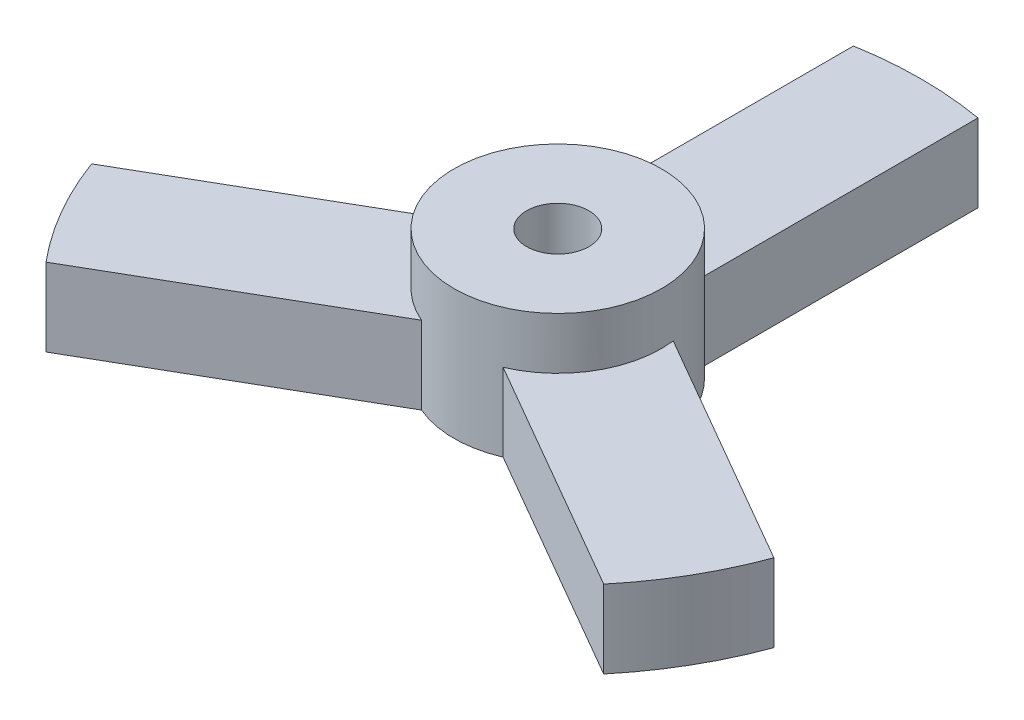
ISO-10303-21;
HEADER;
FILE_DESCRIPTION(('STEP AP214'),'2;1');
FILE_NAME('part.step','',(''),(''),'','','');
FILE_SCHEMA(('AUTOMOTIVE_DESIGN { 1 0 10303 214 1 1 1 1 }'));
ENDSEC;
DATA;
#1=APPLICATION_CONTEXT('core data for automotive mechanical design processes');
#2=APPLICATION_PROTOCOL_DEFINITION('international standard','automotive_design',2000,#1);
#3=PRODUCT_CONTEXT('',#1,'mechanical');
#4=PRODUCT('Part','Part','',(#3));
#5=PRODUCT_RELATED_PRODUCT_CATEGORY('part','',(#4));
#6=PRODUCT_DEFINITION_FORMATION('','',#4);
#7=PRODUCT_DEFINITION_CONTEXT('part definition',#1,'design');
#8=PRODUCT_DEFINITION('design','',#6,#7);
#9=PRODUCT_DEFINITION_SHAPE('','',#8);
#10=(LENGTH_UNIT() NAMED_UNIT(*) SI_UNIT(.MILLI.,.METRE.));
#11=(NAMED_UNIT(*) PLANE_ANGLE_UNIT() SI_UNIT($,.RADIAN.));
#12=(NAMED_UNIT(*) SI_UNIT($,.STERADIAN.) SOLID_ANGLE_UNIT());
#13=UNCERTAINTY_MEASURE_WITH_UNIT(LENGTH_MEASURE(1.E-05),#10,'distance_accuracy_value','');
#14=(GEOMETRIC_REPRESENTATION_CONTEXT(3) GLOBAL_UNCERTAINTY_ASSIGNED_CONTEXT((#13)) GLOBAL_UNIT_ASSIGNED_CONTEXT((#10,
#11,#12)) REPRESENTATION_CONTEXT('',''));
#15=CARTESIAN_POINT('',(0.,0.,0.));
#16=DIRECTION('',(0.,0.,1.));
#17=DIRECTION('',(1.,0.,0.));
#18=AXIS2_PLACEMENT_3D('',#15,#16,#17);
#19=CARTESIAN_POINT('',(0.,7.5,0.));
#20=DIRECTION('',(0.,-1.,0.));
#21=DIRECTION('',(0.,0.,-1.));
#22=AXIS2_PLACEMENT_3D('',#19,#20,#21);
#23=PLANE('',#22);
#24=CARTESIAN_POINT('',(0.,7.5,0.));
#25=DIRECTION('',(0.,1.,0.));
#26=DIRECTION('',(0.,0.,1.));
#27=AXIS2_PLACEMENT_3D('',#24,#25,#26);
#28=CIRCLE('',#27,10.);
#29=CARTESIAN_POINT('',(3.92820323027547,7.5,9.19615242270665));
#30=VERTEX_POINT('',#29);
#31=CARTESIAN_POINT('',(9.92820323027551,7.5,-1.19615242270659));
#32=VERTEX_POINT('',#31);
#33=EDGE_CURVE('E49',#30,#32,#28,.T.);
#34=ORIENTED_EDGE('',*,*,#33,.F.);
#35=DIRECTION('',(0.866025403784436,0.,0.500000000000004));
#36=VECTOR('',#35,1.);
#37=CARTESIAN_POINT('',(26.8621834432781,7.5,22.4370920722734));
#38=LINE('',#37,#36);
#39=CARTESIAN_POINT('',(26.8621834432781,7.5,22.4370920722734));
#40=VERTEX_POINT('',#39);
#41=EDGE_CURVE('E220',#30,#40,#38,.T.);
#42=ORIENTED_EDGE('',*,*,#41,.T.);
#43=CARTESIAN_POINT('',(0.,7.5,0.));
#44=DIRECTION('',(0.,1.,0.));
#45=DIRECTION('',(0.,0.,-1.));
#46=AXIS2_PLACEMENT_3D('',#43,#44,#45);
#47=CIRCLE('',#46,35.);
#48=CARTESIAN_POINT('',(32.8621834432782,7.5,12.0447872268602));
#49=VERTEX_POINT('',#48);
#50=EDGE_CURVE('E143',#40,#49,#47,.T.);
#51=ORIENTED_EDGE('',*,*,#50,.T.);
#52=DIRECTION('',(-0.866025403784436,0.,-0.500000000000004));
#53=VECTOR('',#52,1.);
#54=CARTESIAN_POINT('',(32.8621834432782,7.5,12.0447872268602));
#55=LINE('',#54,#53);
#56=EDGE_CURVE('E139',#49,#32,#55,.T.);
#57=ORIENTED_EDGE('',*,*,#56,.T.);
#58=EDGE_LOOP('',(#34,#42,#51,#57));
#59=FACE_BOUND('',#58,.T.);
#60=ADVANCED_FACE('F37',(#59),#23,.F.);
#61=CARTESIAN_POINT('',(6.,7.5,-8.));
#62=VERTEX_POINT('',#61);
#63=CARTESIAN_POINT('',(-6.,7.5,-8.));
#64=VERTEX_POINT('',#63);
#65=EDGE_CURVE('E11',#62,#64,#28,.T.);
#66=ORIENTED_EDGE('',*,*,#65,.F.);
#67=DIRECTION('',(0.,0.,-1.));
#68=VECTOR('',#67,1.);
#69=CARTESIAN_POINT('',(6.,7.5,-34.4818792991333));
#70=LINE('',#69,#68);
#71=CARTESIAN_POINT('',(6.,7.5,-34.4818792991333));
#72=VERTEX_POINT('',#71);
#73=EDGE_CURVE('E57',#62,#72,#70,.T.);
#74=ORIENTED_EDGE('',*,*,#73,.T.);
#75=CARTESIAN_POINT('',(0.,7.5,0.));
#76=DIRECTION('',(0.,1.,0.));
#77=DIRECTION('',(0.,0.,-1.));
#78=AXIS2_PLACEMENT_3D('',#75,#76,#77);
#79=CIRCLE('',#78,35.);
#80=CARTESIAN_POINT('',(-6.,7.5,-34.4818792991333));
#81=VERTEX_POINT('',#80);
#82=EDGE_CURVE('E198',#72,#81,#79,.T.);
#83=ORIENTED_EDGE('',*,*,#82,.T.);
#84=DIRECTION('',(0.,0.,1.));
#85=VECTOR('',#84,1.);
#86=CARTESIAN_POINT('',(-6.,7.5,-34.4818792991333));
#87=LINE('',#86,#85);
#88=EDGE_CURVE('E114',#81,#64,#87,.T.);
#89=ORIENTED_EDGE('',*,*,#88,.T.);
#90=EDGE_LOOP('',(#66,#74,#83,#89));
#91=FACE_BOUND('',#90,.T.);
#92=ADVANCED_FACE('F229',(#91),#23,.F.);
#93=CARTESIAN_POINT('',(-9.9282032302755,7.5,-1.19615242270672));
#94=VERTEX_POINT('',#93);
#95=CARTESIAN_POINT('',(-3.92820323027559,7.5,9.1961524227066));
#96=VERTEX_POINT('',#95);
#97=EDGE_CURVE('E47',#94,#96,#28,.T.);
#98=ORIENTED_EDGE('',*,*,#97,.F.);
#99=DIRECTION('',(-0.866025403784443,0.,0.499999999999992));
#100=VECTOR('',#99,1.);
#101=CARTESIAN_POINT('',(-32.8621834432783,7.5,12.0447872268597));
#102=LINE('',#101,#100);
#103=CARTESIAN_POINT('',(-32.8621834432783,7.5,12.0447872268597));
#104=VERTEX_POINT('',#103);
#105=EDGE_CURVE('E226',#94,#104,#102,.T.);
#106=ORIENTED_EDGE('',*,*,#105,.T.);
#107=CARTESIAN_POINT('',(0.,7.5,0.));
#108=DIRECTION('',(0.,1.,0.));
#109=DIRECTION('',(0.,0.,-1.));
#110=AXIS2_PLACEMENT_3D('',#107,#108,#109);
#111=CIRCLE('',#110,35.);
#112=CARTESIAN_POINT('',(-26.8621834432784,7.5,22.4370920722731));
#113=VERTEX_POINT('',#112);
#114=EDGE_CURVE('E224',#104,#113,#111,.T.);
#115=ORIENTED_EDGE('',*,*,#114,.T.);
#116=DIRECTION('',(0.866025403784443,0.,-0.499999999999992));
#117=VECTOR('',#116,1.);
#118=CARTESIAN_POINT('',(-26.8621834432784,7.5,22.4370920722731));
#119=LINE('',#118,#117);
#120=EDGE_CURVE('E222',#113,#96,#119,.T.);
#121=ORIENTED_EDGE('',*,*,#120,.T.);
#122=EDGE_LOOP('',(#98,#106,#115,#121));
#123=FACE_BOUND('',#122,.T.);
#124=ADVANCED_FACE('F250',(#123),#23,.F.);
#125=CARTESIAN_POINT('',(0.,7.5,0.));
#126=DIRECTION('',(0.,-1.,0.));
#127=DIRECTION('',(0.,0.,-1.));
#128=AXIS2_PLACEMENT_3D('',#125,#126,#127);
#129=CYLINDRICAL_SURFACE('',#128,35.);
#130=CARTESIAN_POINT('',(0.,0.,0.));
#131=DIRECTION('',(0.,1.,0.));
#132=DIRECTION('',(0.,0.,-1.));
#133=AXIS2_PLACEMENT_3D('',#130,#131,#132);
#134=CIRCLE('',#133,35.);
#135=CARTESIAN_POINT('',(6.,0.,-34.4818792991333));
#136=VERTEX_POINT('',#135);
#137=CARTESIAN_POINT('',(-6.,0.,-34.4818792991333));
#138=VERTEX_POINT('',#137);
#139=EDGE_CURVE('E163',#136,#138,#134,.T.);
#140=ORIENTED_EDGE('',*,*,#139,.T.);
#141=DIRECTION('',(0.,-1.,0.));
#142=VECTOR('',#141,1.);
#143=CARTESIAN_POINT('',(-6.,7.5,-34.4818792991333));
#144=LINE('',#143,#142);
#145=EDGE_CURVE('E41',#81,#138,#144,.T.);
#146=ORIENTED_EDGE('',*,*,#145,.F.);
#147=ORIENTED_EDGE('',*,*,#82,.F.);
#148=DIRECTION('',(0.,-1.,0.));
#149=VECTOR('',#148,1.);
#150=CARTESIAN_POINT('',(6.,7.5,-34.4818792991333));
#151=LINE('',#150,#149);
#152=EDGE_CURVE('E195',#72,#136,#151,.T.);
#153=ORIENTED_EDGE('',*,*,#152,.T.);
#154=EDGE_LOOP('',(#140,#146,#147,#153));
#155=FACE_BOUND('',#154,.T.);
#156=ADVANCED_FACE('F39',(#155),#129,.T.);
#157=CARTESIAN_POINT('',(-6.,7.5,-34.4818792991333));
#158=DIRECTION('',(1.,0.,0.));
#159=DIRECTION('',(0.,0.,-1.));
#160=AXIS2_PLACEMENT_3D('',#157,#158,#159);
#161=PLANE('',#160);
#162=DIRECTION('',(0.,0.,1.));
#163=VECTOR('',#162,1.);
#164=CARTESIAN_POINT('',(-6.,0.,-34.4818792991333));
#165=LINE('',#164,#163);
#166=CARTESIAN_POINT('',(-6.,0.,-8.));
#167=VERTEX_POINT('',#166);
#168=EDGE_CURVE('E215',#138,#167,#165,.T.);
#169=ORIENTED_EDGE('',*,*,#168,.T.);
#170=DIRECTION('',(0.,-1.,0.));
#171=VECTOR('',#170,1.);
#172=CARTESIAN_POINT('',(-6.,7.5,-8.));
#173=LINE('',#172,#171);
#174=EDGE_CURVE('E172',#64,#167,#173,.T.);
#175=ORIENTED_EDGE('',*,*,#174,.F.);
#176=ORIENTED_EDGE('',*,*,#88,.F.);
#177=ORIENTED_EDGE('',*,*,#145,.T.);
#178=EDGE_LOOP('',(#169,#175,#176,#177));
#179=FACE_BOUND('',#178,.T.);
#180=ADVANCED_FACE('F235',(#179),#161,.F.);
#181=CARTESIAN_POINT('',(-32.8621834432783,7.5,12.0447872268597));
#182=DIRECTION('',(0.499999999999992,0.,0.866025403784443));
#183=DIRECTION('',(0.866025403784443,0.,-0.499999999999992));
#184=AXIS2_PLACEMENT_3D('',#181,#182,#183);
#185=PLANE('',#184);
#186=DIRECTION('',(-0.866025403784443,0.,0.499999999999992));
#187=VECTOR('',#186,1.);
#188=CARTESIAN_POINT('',(-32.8621834432783,0.,12.0447872268597));
#189=LINE('',#188,#187);
#190=CARTESIAN_POINT('',(-9.9282032302755,0.,-1.19615242270672));
#191=VERTEX_POINT('',#190);
#192=CARTESIAN_POINT('',(-32.8621834432783,0.,12.0447872268597));
#193=VERTEX_POINT('',#192);
#194=EDGE_CURVE('E211',#191,#193,#189,.T.);
#195=ORIENTED_EDGE('',*,*,#194,.T.);
#196=DIRECTION('',(0.,-1.,0.));
#197=VECTOR('',#196,1.);
#198=CARTESIAN_POINT('',(-32.8621834432783,7.5,12.0447872268597));
#199=LINE('',#198,#197);
#200=EDGE_CURVE('E179',#104,#193,#199,.T.);
#201=ORIENTED_EDGE('',*,*,#200,.F.);
#202=ORIENTED_EDGE('',*,*,#105,.F.);
#203=DIRECTION('',(0.,-1.,0.));
#204=VECTOR('',#203,1.);
#205=CARTESIAN_POINT('',(-9.9282032302755,7.5,-1.19615242270672));
#206=LINE('',#205,#204);
#207=EDGE_CURVE('E176',#94,#191,#206,.T.);
#208=ORIENTED_EDGE('',*,*,#207,.T.);
#209=EDGE_LOOP('',(#195,#201,#202,#208));
#210=FACE_BOUND('',#209,.T.);
#211=ADVANCED_FACE('F265',(#210),#185,.F.);
#212=CARTESIAN_POINT('',(0.,7.5,0.));
#213=DIRECTION('',(0.,-1.,0.));
#214=DIRECTION('',(0.,0.,-1.));
#215=AXIS2_PLACEMENT_3D('',#212,#213,#214);
#216=CYLINDRICAL_SURFACE('',#215,35.);
#217=CARTESIAN_POINT('',(0.,0.,0.));
#218=DIRECTION('',(0.,1.,0.));
#219=DIRECTION('',(0.,0.,-1.));
#220=AXIS2_PLACEMENT_3D('',#217,#218,#219);
#221=CIRCLE('',#220,35.);
#222=CARTESIAN_POINT('',(-26.8621834432784,0.,22.4370920722731));
#223=VERTEX_POINT('',#222);
#224=EDGE_CURVE('E209',#193,#223,#221,.T.);
#225=ORIENTED_EDGE('',*,*,#224,.T.);
#226=DIRECTION('',(0.,-1.,0.));
#227=VECTOR('',#226,1.);
#228=CARTESIAN_POINT('',(-26.8621834432784,7.5,22.4370920722731));
#229=LINE('',#228,#227);
#230=EDGE_CURVE('E184',#113,#223,#229,.T.);
#231=ORIENTED_EDGE('',*,*,#230,.F.);
#232=ORIENTED_EDGE('',*,*,#114,.F.);
#233=ORIENTED_EDGE('',*,*,#200,.T.);
#234=EDGE_LOOP('',(#225,#231,#232,#233));
#235=FACE_BOUND('',#234,.T.);
#236=ADVANCED_FACE('F270',(#235),#216,.T.);
#237=CARTESIAN_POINT('',(-26.8621834432784,7.5,22.4370920722731));
#238=DIRECTION('',(-0.499999999999992,0.,-0.866025403784443));
#239=DIRECTION('',(-0.866025403784443,0.,0.499999999999992));
#240=AXIS2_PLACEMENT_3D('',#237,#238,#239);
#241=PLANE('',#240);
#242=DIRECTION('',(0.866025403784443,0.,-0.499999999999992));
#243=VECTOR('',#242,1.);
#244=CARTESIAN_POINT('',(-26.8621834432784,0.,22.4370920722731));
#245=LINE('',#244,#243);
#246=CARTESIAN_POINT('',(-3.92820323027559,0.,9.1961524227066));
#247=VERTEX_POINT('',#246);
#248=EDGE_CURVE('E207',#223,#247,#245,.T.);
#249=ORIENTED_EDGE('',*,*,#248,.T.);
#250=DIRECTION('',(0.,-1.,0.));
#251=VECTOR('',#250,1.);
#252=CARTESIAN_POINT('',(-3.92820323027559,7.5,9.1961524227066));
#253=LINE('',#252,#251);
#254=EDGE_CURVE('E187',#96,#247,#253,.T.);
#255=ORIENTED_EDGE('',*,*,#254,.F.);
#256=ORIENTED_EDGE('',*,*,#120,.F.);
#257=ORIENTED_EDGE('',*,*,#230,.T.);
#258=EDGE_LOOP('',(#249,#255,#256,#257));
#259=FACE_BOUND('',#258,.T.);
#260=ADVANCED_FACE('F273',(#259),#241,.F.);
#261=CARTESIAN_POINT('',(26.8621834432781,7.5,22.4370920722734));
#262=DIRECTION('',(0.500000000000004,0.,-0.866025403784436));
#263=DIRECTION('',(-0.866025403784436,0.,-0.500000000000004));
#264=AXIS2_PLACEMENT_3D('',#261,#262,#263);
#265=PLANE('',#264);
#266=DIRECTION('',(0.866025403784436,0.,0.500000000000004));
#267=VECTOR('',#266,1.);
#268=CARTESIAN_POINT('',(26.8621834432781,0.,22.4370920722734));
#269=LINE('',#268,#267);
#270=CARTESIAN_POINT('',(3.92820323027547,0.,9.19615242270665));
#271=VERTEX_POINT('',#270);
#272=CARTESIAN_POINT('',(26.8621834432781,0.,22.4370920722734));
#273=VERTEX_POINT('',#272);
#274=EDGE_CURVE('E203',#271,#273,#269,.T.);
#275=ORIENTED_EDGE('',*,*,#274,.T.);
#276=DIRECTION('',(0.,-1.,0.));
#277=VECTOR('',#276,1.);
#278=CARTESIAN_POINT('',(26.8621834432781,7.5,22.4370920722734));
#279=LINE('',#278,#277);
#280=EDGE_CURVE('E190',#40,#273,#279,.T.);
#281=ORIENTED_EDGE('',*,*,#280,.F.);
#282=ORIENTED_EDGE('',*,*,#41,.F.);
#283=DIRECTION('',(0.,-1.,0.));
#284=VECTOR('',#283,1.);
#285=CARTESIAN_POINT('',(3.92820323027547,7.5,9.19615242270665));
#286=LINE('',#285,#284);
#287=EDGE_CURVE('E159',#30,#271,#286,.T.);
#288=ORIENTED_EDGE('',*,*,#287,.T.);
#289=EDGE_LOOP('',(#275,#281,#282,#288));
#290=FACE_BOUND('',#289,.T.);
#291=ADVANCED_FACE('F279',(#290),#265,.F.);
#292=CARTESIAN_POINT('',(0.,7.5,0.));
#293=DIRECTION('',(0.,-1.,0.));
#294=DIRECTION('',(0.,0.,-1.));
#295=AXIS2_PLACEMENT_3D('',#292,#293,#294);
#296=CYLINDRICAL_SURFACE('',#295,35.);
#297=CARTESIAN_POINT('',(0.,0.,0.));
#298=DIRECTION('',(0.,1.,0.));
#299=DIRECTION('',(0.,0.,-1.));
#300=AXIS2_PLACEMENT_3D('',#297,#298,#299);
#301=CIRCLE('',#300,35.);
#302=CARTESIAN_POINT('',(32.8621834432782,0.,12.0447872268602));
#303=VERTEX_POINT('',#302);
#304=EDGE_CURVE('E201',#273,#303,#301,.T.);
#305=ORIENTED_EDGE('',*,*,#304,.T.);
#306=DIRECTION('',(0.,-1.,0.));
#307=VECTOR('',#306,1.);
#308=CARTESIAN_POINT('',(32.8621834432782,7.5,12.0447872268602));
#309=LINE('',#308,#307);
#310=EDGE_CURVE('E152',#49,#303,#309,.T.);
#311=ORIENTED_EDGE('',*,*,#310,.F.);
#312=ORIENTED_EDGE('',*,*,#50,.F.);
#313=ORIENTED_EDGE('',*,*,#280,.T.);
#314=EDGE_LOOP('',(#305,#311,#312,#313));
#315=FACE_BOUND('',#314,.T.);
#316=ADVANCED_FACE('F282',(#315),#296,.T.);
#317=CARTESIAN_POINT('',(32.8621834432782,7.5,12.0447872268602));
#318=DIRECTION('',(-0.500000000000004,0.,0.866025403784436));
#319=DIRECTION('',(0.866025403784436,0.,0.500000000000004));
#320=AXIS2_PLACEMENT_3D('',#317,#318,#319);
#321=PLANE('',#320);
#322=DIRECTION('',(-0.866025403784436,0.,-0.500000000000004));
#323=VECTOR('',#322,1.);
#324=CARTESIAN_POINT('',(32.8621834432782,0.,12.0447872268602));
#325=LINE('',#324,#323);
#326=CARTESIAN_POINT('',(9.92820323027551,0.,-1.19615242270659));
#327=VERTEX_POINT('',#326);
#328=EDGE_CURVE('E151',#303,#327,#325,.T.);
#329=ORIENTED_EDGE('',*,*,#328,.T.);
#330=DIRECTION('',(0.,-1.,0.));
#331=VECTOR('',#330,1.);
#332=CARTESIAN_POINT('',(9.92820323027551,7.5,-1.19615242270659));
#333=LINE('',#332,#331);
#334=EDGE_CURVE('E148',#32,#327,#333,.T.);
#335=ORIENTED_EDGE('',*,*,#334,.F.);
#336=ORIENTED_EDGE('',*,*,#56,.F.);
#337=ORIENTED_EDGE('',*,*,#310,.T.);
#338=EDGE_LOOP('',(#329,#335,#336,#337));
#339=FACE_BOUND('',#338,.T.);
#340=ADVANCED_FACE('F149',(#339),#321,.F.);
#341=CARTESIAN_POINT('',(0.,7.5,0.));
#342=DIRECTION('',(0.,-1.,0.));
#343=DIRECTION('',(0.,0.,-1.));
#344=AXIS2_PLACEMENT_3D('',#341,#342,#343);
#345=CYLINDRICAL_SURFACE('',#344,10.);
#346=CARTESIAN_POINT('',(0.,0.,0.));
#347=DIRECTION('',(0.,1.,0.));
#348=DIRECTION('',(0.,0.,-1.));
#349=AXIS2_PLACEMENT_3D('',#346,#347,#348);
#350=CIRCLE('',#349,10.);
#351=CARTESIAN_POINT('',(6.,0.,-8.));
#352=VERTEX_POINT('',#351);
#353=EDGE_CURVE('E99',#327,#352,#350,.T.);
#354=ORIENTED_EDGE('',*,*,#353,.T.);
#355=DIRECTION('',(0.,-1.,0.));
#356=VECTOR('',#355,1.);
#357=CARTESIAN_POINT('',(6.,7.5,-8.));
#358=LINE('',#357,#356);
#359=EDGE_CURVE('E153',#62,#352,#358,.T.);
#360=ORIENTED_EDGE('',*,*,#359,.F.);
#361=ORIENTED_EDGE('',*,*,#65,.T.);
#362=ORIENTED_EDGE('',*,*,#174,.T.);
#363=CARTESIAN_POINT('',(0.,0.,0.));
#364=DIRECTION('',(0.,1.,0.));
#365=DIRECTION('',(0.,0.,-1.));
#366=AXIS2_PLACEMENT_3D('',#363,#364,#365);
#367=CIRCLE('',#366,10.);
#368=EDGE_CURVE('E213',#167,#191,#367,.T.);
#369=ORIENTED_EDGE('',*,*,#368,.T.);
#370=ORIENTED_EDGE('',*,*,#207,.F.);
#371=ORIENTED_EDGE('',*,*,#97,.T.);
#372=ORIENTED_EDGE('',*,*,#254,.T.);
#373=CARTESIAN_POINT('',(0.,0.,-1.07552855510562E-13));
#374=DIRECTION('',(0.,1.,0.));
#375=DIRECTION('',(0.,0.,1.));
#376=AXIS2_PLACEMENT_3D('',#373,#374,#375);
#377=CIRCLE('',#376,10.0000000000001);
#378=EDGE_CURVE('E205',#247,#271,#377,.T.);
#379=ORIENTED_EDGE('',*,*,#378,.T.);
#380=ORIENTED_EDGE('',*,*,#287,.F.);
#381=ORIENTED_EDGE('',*,*,#33,.T.);
#382=ORIENTED_EDGE('',*,*,#334,.T.);
#383=EDGE_LOOP('',(#354,#360,#361,#362,#369,#370,#371,#372,#379,#380,#381,#382));
#384=FACE_BOUND('',#383,.T.);
#385=CARTESIAN_POINT('',(0.,12.5,0.));
#386=DIRECTION('',(0.,1.,0.));
#387=DIRECTION('',(0.,0.,1.));
#388=AXIS2_PLACEMENT_3D('',#385,#386,#387);
#389=CIRCLE('',#388,10.);
#390=CARTESIAN_POINT('',(0.,12.5,10.));
#391=VERTEX_POINT('',#390);
#392=EDGE_CURVE('E160',#391,#391,#389,.T.);
#393=ORIENTED_EDGE('',*,*,#392,.F.);
#394=EDGE_LOOP('',(#393));
#395=FACE_BOUND('',#394,.T.);
#396=ADVANCED_FACE('F156',(#384,#395),#345,.T.);
#397=CARTESIAN_POINT('',(6.,7.5,-34.4818792991333));
#398=DIRECTION('',(-1.,0.,0.));
#399=DIRECTION('',(0.,0.,1.));
#400=AXIS2_PLACEMENT_3D('',#397,#398,#399);
#401=PLANE('',#400);
#402=DIRECTION('',(0.,0.,-1.));
#403=VECTOR('',#402,1.);
#404=CARTESIAN_POINT('',(6.,0.,-34.4818792991333));
#405=LINE('',#404,#403);
#406=EDGE_CURVE('E105',#352,#136,#405,.T.);
#407=ORIENTED_EDGE('',*,*,#406,.T.);
#408=ORIENTED_EDGE('',*,*,#152,.F.);
#409=ORIENTED_EDGE('',*,*,#73,.F.);
#410=ORIENTED_EDGE('',*,*,#359,.T.);
#411=EDGE_LOOP('',(#407,#408,#409,#410));
#412=FACE_BOUND('',#411,.T.);
#413=ADVANCED_FACE('F236',(#412),#401,.F.);
#414=CARTESIAN_POINT('',(0.,0.,0.));
#415=DIRECTION('',(0.,-1.,0.));
#416=DIRECTION('',(0.,0.,-1.));
#417=AXIS2_PLACEMENT_3D('',#414,#415,#416);
#418=PLANE('',#417);
#419=CARTESIAN_POINT('',(0.,0.,0.));
#420=DIRECTION('',(0.,-1.,0.));
#421=DIRECTION('',(1.,0.,0.));
#422=AXIS2_PLACEMENT_3D('',#419,#420,#421);
#423=CIRCLE('',#422,6.00000000000006);
#424=CARTESIAN_POINT('',(6.,0.,0.));
#425=VERTEX_POINT('',#424);
#426=EDGE_CURVE('E402',#425,#425,#423,.T.);
#427=ORIENTED_EDGE('',*,*,#426,.F.);
#428=EDGE_LOOP('',(#427));
#429=FACE_BOUND('',#428,.T.);
#430=ORIENTED_EDGE('',*,*,#139,.F.);
#431=ORIENTED_EDGE('',*,*,#406,.F.);
#432=ORIENTED_EDGE('',*,*,#353,.F.);
#433=ORIENTED_EDGE('',*,*,#328,.F.);
#434=ORIENTED_EDGE('',*,*,#304,.F.);
#435=ORIENTED_EDGE('',*,*,#274,.F.);
#436=ORIENTED_EDGE('',*,*,#378,.F.);
#437=ORIENTED_EDGE('',*,*,#248,.F.);
#438=ORIENTED_EDGE('',*,*,#224,.F.);
#439=ORIENTED_EDGE('',*,*,#194,.F.);
#440=ORIENTED_EDGE('',*,*,#368,.F.);
#441=ORIENTED_EDGE('',*,*,#168,.F.);
#442=EDGE_LOOP('',(#430,#431,#432,#433,#434,#435,#436,#437,#438,#439,#440,#441));
#443=FACE_BOUND('',#442,.T.);
#444=ADVANCED_FACE('F233',(#429,#443),#418,.T.);
#445=CARTESIAN_POINT('',(0.,12.5,0.));
#446=DIRECTION('',(0.,1.,0.));
#447=DIRECTION('',(0.,0.,1.));
#448=AXIS2_PLACEMENT_3D('',#445,#446,#447);
#449=PLANE('',#448);
#450=CARTESIAN_POINT('',(0.,12.5,0.));
#451=DIRECTION('',(0.,-1.,0.));
#452=DIRECTION('',(1.,0.,0.));
#453=AXIS2_PLACEMENT_3D('',#450,#451,#452);
#454=CIRCLE('',#453,3.);
#455=CARTESIAN_POINT('',(3.,12.5,0.));
#456=VERTEX_POINT('',#455);
#457=EDGE_CURVE('E161',#456,#456,#454,.T.);
#458=ORIENTED_EDGE('',*,*,#457,.T.);
#459=EDGE_LOOP('',(#458));
#460=FACE_BOUND('',#459,.T.);
#461=ORIENTED_EDGE('',*,*,#392,.T.);
#462=EDGE_LOOP('',(#461));
#463=FACE_BOUND('',#462,.T.);
#464=ADVANCED_FACE('F244',(#460,#463),#449,.T.);
#465=CARTESIAN_POINT('',(0.,0.,0.));
#466=DIRECTION('',(0.,-1.,0.));
#467=DIRECTION('',(1.,0.,0.));
#468=AXIS2_PLACEMENT_3D('',#465,#466,#467);
#469=CYLINDRICAL_SURFACE('',#468,3.00000000000003);
#470=ORIENTED_EDGE('',*,*,#457,.F.);
#471=EDGE_LOOP('',(#470));
#472=FACE_BOUND('',#471,.T.);
#473=CARTESIAN_POINT('',(0.,1.73205080756891,0.));
#474=DIRECTION('',(0.,-1.,0.));
#475=DIRECTION('',(1.,0.,0.));
#476=AXIS2_PLACEMENT_3D('',#473,#474,#475);
#477=CIRCLE('',#476,3.00000000000006);
#478=CARTESIAN_POINT('',(3.,1.73205080756889,0.));
#479=VERTEX_POINT('',#478);
#480=EDGE_CURVE('E166',#479,#479,#477,.T.);
#481=ORIENTED_EDGE('',*,*,#480,.T.);
#482=EDGE_LOOP('',(#481));
#483=FACE_BOUND('',#482,.T.);
#484=ADVANCED_FACE('F376',(#472,#483),#469,.F.);
#485=CARTESIAN_POINT('',(0.,0.,0.));
#486=DIRECTION('',(0.,-1.,0.));
#487=DIRECTION('',(1.,0.,0.));
#488=AXIS2_PLACEMENT_3D('',#485,#486,#487);
#489=CONICAL_SURFACE('',#488,6.00000000000006,1.0471975511966);
#490=ORIENTED_EDGE('',*,*,#480,.F.);
#491=EDGE_LOOP('',(#490));
#492=FACE_BOUND('',#491,.T.);
#493=ORIENTED_EDGE('',*,*,#426,.T.);
#494=EDGE_LOOP('',(#493));
#495=FACE_BOUND('',#494,.T.);
#496=ADVANCED_FACE('F384',(#492,#495),#489,.F.);
#497=CLOSED_SHELL('',(#60,#92,#124,#156,#180,#211,#236,#260,#291,#316,#340,#396,#413,#444,#464,
#484,#496));
#498=MANIFOLD_SOLID_BREP('B2',#497);
#499=ADVANCED_BREP_SHAPE_REPRESENTATION('',(#18,#498),#14);
#500=SHAPE_DEFINITION_REPRESENTATION(#9,#499);
ENDSEC;
END-ISO-10303-21;
